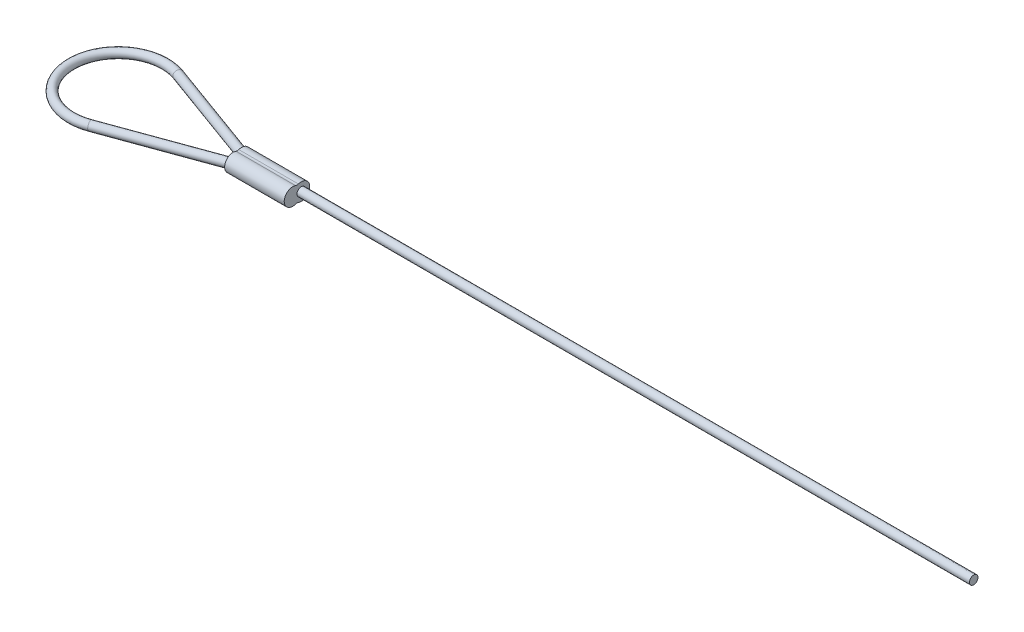
ISO-10303-21;
HEADER;
FILE_DESCRIPTION(('STEP AP214'),'2;1');
FILE_NAME('part.step','',(''),(''),'','','');
FILE_SCHEMA(('AUTOMOTIVE_DESIGN { 1 0 10303 214 1 1 1 1 }'));
ENDSEC;
DATA;
#1=APPLICATION_CONTEXT('core data for automotive mechanical design processes');
#2=APPLICATION_PROTOCOL_DEFINITION('international standard','automotive_design',2000,#1);
#3=PRODUCT_CONTEXT('',#1,'mechanical');
#4=PRODUCT('Part','Part','',(#3));
#5=PRODUCT_RELATED_PRODUCT_CATEGORY('part','',(#4));
#6=PRODUCT_DEFINITION_FORMATION('','',#4);
#7=PRODUCT_DEFINITION_CONTEXT('part definition',#1,'design');
#8=PRODUCT_DEFINITION('design','',#6,#7);
#9=PRODUCT_DEFINITION_SHAPE('','',#8);
#10=(LENGTH_UNIT() NAMED_UNIT(*) SI_UNIT(.MILLI.,.METRE.));
#11=(NAMED_UNIT(*) PLANE_ANGLE_UNIT() SI_UNIT($,.RADIAN.));
#12=(NAMED_UNIT(*) SI_UNIT($,.STERADIAN.) SOLID_ANGLE_UNIT());
#13=UNCERTAINTY_MEASURE_WITH_UNIT(LENGTH_MEASURE(1.E-05),#10,'distance_accuracy_value','');
#14=(GEOMETRIC_REPRESENTATION_CONTEXT(3) GLOBAL_UNCERTAINTY_ASSIGNED_CONTEXT((#13)) GLOBAL_UNIT_ASSIGNED_CONTEXT((#10,
#11,#12)) REPRESENTATION_CONTEXT('',''));
#15=CARTESIAN_POINT('',(0.,0.,0.));
#16=DIRECTION('',(0.,0.,1.));
#17=DIRECTION('',(1.,0.,0.));
#18=AXIS2_PLACEMENT_3D('',#15,#16,#17);
#19=CARTESIAN_POINT('',(0.,0.,0.));
#20=DIRECTION('',(0.,-1.,0.));
#21=DIRECTION('',(0.,0.,-1.));
#22=AXIS2_PLACEMENT_3D('',#19,#20,#21);
#23=TOROIDAL_SURFACE('',#22,5.5,0.5);
#24=CARTESIAN_POINT('',(1.88111078829118,0.,5.1683094143225));
#25=DIRECTION('',(-0.939692620785908,0.,0.342020143325669));
#26=DIRECTION('',(0.342020143325669,0.,0.939692620785908));
#27=AXIS2_PLACEMENT_3D('',#24,#25,#26);
#28=CIRCLE('',#27,0.5);
#29=CARTESIAN_POINT('',(2.05212085995401,0.,5.63815572471545));
#30=VERTEX_POINT('',#29);
#31=EDGE_CURVE('E67',#30,#30,#28,.F.);
#32=CARTESIAN_POINT('',(1.88111078829118,0.,-5.1683094143225));
#33=DIRECTION('',(-0.939692620785908,0.,-0.342020143325669));
#34=DIRECTION('',(-0.342020143325669,0.,0.939692620785908));
#35=AXIS2_PLACEMENT_3D('',#32,#33,#34);
#36=CIRCLE('',#35,0.5);
#37=CARTESIAN_POINT('',(2.05212085995401,0.,-5.63815572471544));
#38=VERTEX_POINT('',#37);
#39=EDGE_CURVE('E220',#38,#38,#36,.F.);
#40=CARTESIAN_POINT('',(0.,0.,0.));
#41=DIRECTION('',(0.,-1.,0.));
#42=DIRECTION('',(0.,0.,-1.));
#43=AXIS2_PLACEMENT_3D('',#40,#41,#42);
#44=CIRCLE('',#43,5.99999999999999);
#45=EDGE_CURVE('',#30,#38,#44,.T.);
#46=ORIENTED_EDGE('',*,*,#31,.F.);
#47=ORIENTED_EDGE('',*,*,#39,.F.);
#48=ORIENTED_EDGE('',*,*,#45,.T.);
#49=ORIENTED_EDGE('',*,*,#45,.F.);
#50=EDGE_LOOP('',(#46,#48,#47,#49));
#51=FACE_BOUND('',#50,.T.);
#52=ADVANCED_FACE('F18',(#51),#23,.T.);
#53=CARTESIAN_POINT('',(1.88111078829118,0.,-5.1683094143225));
#54=DIRECTION('',(-0.939692620785908,0.,-0.342020143325669));
#55=DIRECTION('',(-0.342020143325669,0.,0.939692620785908));
#56=AXIS2_PLACEMENT_3D('',#53,#54,#55);
#57=CYLINDRICAL_SURFACE('',#56,0.5);
#58=ORIENTED_EDGE('',*,*,#39,.T.);
#59=EDGE_LOOP('',(#58));
#60=FACE_BOUND('',#59,.T.);
#61=CARTESIAN_POINT('',(14.,0.,-0.757394468890685));
#62=DIRECTION('',(1.,0.,0.));
#63=DIRECTION('',(0.,0.,-1.));
#64=AXIS2_PLACEMENT_3D('',#61,#62,#63);
#65=ELLIPSE('',#64,0.532088886237956,0.5);
#66=CARTESIAN_POINT('',(14.,0.,-1.28948335512864));
#67=VERTEX_POINT('',#66);
#68=EDGE_CURVE('E66',#67,#67,#65,.F.);
#69=ORIENTED_EDGE('',*,*,#68,.T.);
#70=EDGE_LOOP('',(#69));
#71=FACE_BOUND('',#70,.T.);
#72=ADVANCED_FACE('F100',(#60,#71),#57,.T.);
#73=CARTESIAN_POINT('',(1.88111078829118,0.,5.1683094143225));
#74=DIRECTION('',(-0.939692620785908,0.,0.342020143325669));
#75=DIRECTION('',(0.342020143325669,0.,0.939692620785908));
#76=AXIS2_PLACEMENT_3D('',#73,#74,#75);
#77=CYLINDRICAL_SURFACE('',#76,0.5);
#78=ORIENTED_EDGE('',*,*,#31,.T.);
#79=EDGE_LOOP('',(#78));
#80=FACE_BOUND('',#79,.T.);
#81=CARTESIAN_POINT('',(14.,0.,0.757394468890685));
#82=DIRECTION('',(1.,0.,0.));
#83=DIRECTION('',(0.,0.,1.));
#84=AXIS2_PLACEMENT_3D('',#81,#82,#83);
#85=ELLIPSE('',#84,0.532088886237956,0.5);
#86=CARTESIAN_POINT('',(14.,0.,1.28948335512864));
#87=VERTEX_POINT('',#86);
#88=EDGE_CURVE('E95',#87,#87,#85,.F.);
#89=ORIENTED_EDGE('',*,*,#88,.T.);
#90=EDGE_LOOP('',(#89));
#91=FACE_BOUND('',#90,.T.);
#92=ADVANCED_FACE('F113',(#80,#91),#77,.T.);
#93=CARTESIAN_POINT('',(14.,1.4142135623731,0.));
#94=DIRECTION('',(-1.,0.,0.));
#95=DIRECTION('',(0.,0.,1.));
#96=AXIS2_PLACEMENT_3D('',#93,#94,#95);
#97=CYLINDRICAL_SURFACE('',#96,0.500000000000001);
#98=CARTESIAN_POINT('',(14.,1.4142135623731,0.));
#99=DIRECTION('',(-1.,0.,0.));
#100=DIRECTION('',(0.,0.,1.));
#101=AXIS2_PLACEMENT_3D('',#98,#99,#100);
#102=CIRCLE('',#101,0.500000000000001);
#103=CARTESIAN_POINT('',(14.,0.942809041582065,-0.166666666666666));
#104=VERTEX_POINT('',#103);
#105=CARTESIAN_POINT('',(14.,0.942809041582065,0.166666666666667));
#106=VERTEX_POINT('',#105);
#107=EDGE_CURVE('E93',#104,#106,#102,.T.);
#108=ORIENTED_EDGE('',*,*,#107,.T.);
#109=DIRECTION('',(-1.,0.,0.));
#110=VECTOR('',#109,1.);
#111=CARTESIAN_POINT('',(14.,0.942809041582064,0.166666666666667));
#112=LINE('',#111,#110);
#113=CARTESIAN_POINT('',(21.,0.942809041582065,0.166666666666667));
#114=VERTEX_POINT('',#113);
#115=EDGE_CURVE('E62',#114,#106,#112,.T.);
#116=ORIENTED_EDGE('',*,*,#115,.F.);
#117=CARTESIAN_POINT('',(21.,1.4142135623731,0.));
#118=DIRECTION('',(-1.,0.,0.));
#119=DIRECTION('',(0.,0.,1.));
#120=AXIS2_PLACEMENT_3D('',#117,#118,#119);
#121=CIRCLE('',#120,0.500000000000001);
#122=CARTESIAN_POINT('',(21.,0.942809041582065,-0.166666666666666));
#123=VERTEX_POINT('',#122);
#124=EDGE_CURVE('E21',#123,#114,#121,.T.);
#125=ORIENTED_EDGE('',*,*,#124,.F.);
#126=DIRECTION('',(-1.,0.,0.));
#127=VECTOR('',#126,1.);
#128=CARTESIAN_POINT('',(14.,0.942809041582063,-0.166666666666667));
#129=LINE('',#128,#127);
#130=EDGE_CURVE('E59',#104,#123,#129,.F.);
#131=ORIENTED_EDGE('',*,*,#130,.F.);
#132=EDGE_LOOP('',(#108,#116,#125,#131));
#133=FACE_BOUND('',#132,.T.);
#134=ADVANCED_FACE('F58',(#133),#97,.F.);
#135=CARTESIAN_POINT('',(14.,0.,0.));
#136=DIRECTION('',(1.,0.,0.));
#137=DIRECTION('',(0.,0.,-1.));
#138=AXIS2_PLACEMENT_3D('',#135,#136,#137);
#139=PLANE('',#138);
#140=CARTESIAN_POINT('',(14.,0.,-0.5));
#141=DIRECTION('',(-1.,0.,0.));
#142=DIRECTION('',(0.,0.,1.));
#143=AXIS2_PLACEMENT_3D('',#140,#141,#142);
#144=CIRCLE('',#143,1.);
#145=CARTESIAN_POINT('',(14.,-0.942809041582065,-0.166666666666667));
#146=VERTEX_POINT('',#145);
#147=EDGE_CURVE('E74',#146,#104,#144,.F.);
#148=ORIENTED_EDGE('',*,*,#147,.F.);
#149=CARTESIAN_POINT('',(14.,-1.4142135623731,0.));
#150=DIRECTION('',(-1.,0.,0.));
#151=DIRECTION('',(0.,0.,1.));
#152=AXIS2_PLACEMENT_3D('',#149,#150,#151);
#153=CIRCLE('',#152,0.500000000000001);
#154=CARTESIAN_POINT('',(14.,-0.942809041582065,0.166666666666667));
#155=VERTEX_POINT('',#154);
#156=EDGE_CURVE('E89',#146,#155,#153,.F.);
#157=ORIENTED_EDGE('',*,*,#156,.T.);
#158=CARTESIAN_POINT('',(14.,0.,0.5));
#159=DIRECTION('',(-1.,0.,0.));
#160=DIRECTION('',(0.,0.,1.));
#161=AXIS2_PLACEMENT_3D('',#158,#159,#160);
#162=CIRCLE('',#161,1.);
#163=EDGE_CURVE('E81',#106,#155,#162,.F.);
#164=ORIENTED_EDGE('',*,*,#163,.F.);
#165=ORIENTED_EDGE('',*,*,#107,.F.);
#166=EDGE_LOOP('',(#148,#157,#164,#165));
#167=FACE_BOUND('',#166,.T.);
#168=ORIENTED_EDGE('',*,*,#88,.F.);
#169=EDGE_LOOP('',(#168));
#170=FACE_BOUND('',#169,.T.);
#171=ORIENTED_EDGE('',*,*,#68,.F.);
#172=EDGE_LOOP('',(#171));
#173=FACE_BOUND('',#172,.T.);
#174=ADVANCED_FACE('F102',(#167,#170,#173),#139,.F.);
#175=CARTESIAN_POINT('',(14.,-1.4142135623731,0.));
#176=DIRECTION('',(-1.,0.,0.));
#177=DIRECTION('',(0.,0.,1.));
#178=AXIS2_PLACEMENT_3D('',#175,#176,#177);
#179=CYLINDRICAL_SURFACE('',#178,0.500000000000001);
#180=ORIENTED_EDGE('',*,*,#156,.F.);
#181=DIRECTION('',(-1.,0.,0.));
#182=VECTOR('',#181,1.);
#183=CARTESIAN_POINT('',(14.,-0.942809041582064,-0.166666666666668));
#184=LINE('',#183,#182);
#185=CARTESIAN_POINT('',(21.,-0.942809041582065,-0.166666666666667));
#186=VERTEX_POINT('',#185);
#187=EDGE_CURVE('E88',#186,#146,#184,.T.);
#188=ORIENTED_EDGE('',*,*,#187,.F.);
#189=CARTESIAN_POINT('',(21.,-1.4142135623731,0.));
#190=DIRECTION('',(-1.,0.,0.));
#191=DIRECTION('',(0.,0.,1.));
#192=AXIS2_PLACEMENT_3D('',#189,#190,#191);
#193=CIRCLE('',#192,0.500000000000001);
#194=CARTESIAN_POINT('',(21.,-0.942809041582065,0.166666666666667));
#195=VERTEX_POINT('',#194);
#196=EDGE_CURVE('E35',#195,#186,#193,.T.);
#197=ORIENTED_EDGE('',*,*,#196,.F.);
#198=DIRECTION('',(-1.,0.,0.));
#199=VECTOR('',#198,1.);
#200=CARTESIAN_POINT('',(14.,-0.942809041582064,0.166666666666667));
#201=LINE('',#200,#199);
#202=EDGE_CURVE('E78',#155,#195,#201,.F.);
#203=ORIENTED_EDGE('',*,*,#202,.F.);
#204=EDGE_LOOP('',(#180,#188,#197,#203));
#205=FACE_BOUND('',#204,.T.);
#206=ADVANCED_FACE('F104',(#205),#179,.F.);
#207=CARTESIAN_POINT('',(14.,0.,-0.5));
#208=DIRECTION('',(-1.,0.,0.));
#209=DIRECTION('',(0.,0.,1.));
#210=AXIS2_PLACEMENT_3D('',#207,#208,#209);
#211=CYLINDRICAL_SURFACE('',#210,1.);
#212=ORIENTED_EDGE('',*,*,#130,.T.);
#213=CARTESIAN_POINT('',(21.,0.,-0.5));
#214=DIRECTION('',(-1.,0.,0.));
#215=DIRECTION('',(0.,0.,1.));
#216=AXIS2_PLACEMENT_3D('',#213,#214,#215);
#217=CIRCLE('',#216,1.);
#218=EDGE_CURVE('E72',#186,#123,#217,.F.);
#219=ORIENTED_EDGE('',*,*,#218,.F.);
#220=ORIENTED_EDGE('',*,*,#187,.T.);
#221=ORIENTED_EDGE('',*,*,#147,.T.);
#222=EDGE_LOOP('',(#212,#219,#220,#221));
#223=FACE_BOUND('',#222,.T.);
#224=ADVANCED_FACE('F70',(#223),#211,.T.);
#225=CARTESIAN_POINT('',(14.,0.,0.5));
#226=DIRECTION('',(-1.,0.,0.));
#227=DIRECTION('',(0.,0.,1.));
#228=AXIS2_PLACEMENT_3D('',#225,#226,#227);
#229=CYLINDRICAL_SURFACE('',#228,1.);
#230=ORIENTED_EDGE('',*,*,#163,.T.);
#231=ORIENTED_EDGE('',*,*,#202,.T.);
#232=CARTESIAN_POINT('',(21.,0.,0.5));
#233=DIRECTION('',(-1.,0.,0.));
#234=DIRECTION('',(0.,0.,1.));
#235=AXIS2_PLACEMENT_3D('',#232,#233,#234);
#236=CIRCLE('',#235,1.);
#237=EDGE_CURVE('E77',#114,#195,#236,.F.);
#238=ORIENTED_EDGE('',*,*,#237,.F.);
#239=ORIENTED_EDGE('',*,*,#115,.T.);
#240=EDGE_LOOP('',(#230,#231,#238,#239));
#241=FACE_BOUND('',#240,.T.);
#242=ADVANCED_FACE('F130',(#241),#229,.T.);
#243=CARTESIAN_POINT('',(100.,-1.,5.99999999999999));
#244=DIRECTION('',(-1.,0.,0.));
#245=DIRECTION('',(0.,0.,1.));
#246=AXIS2_PLACEMENT_3D('',#243,#244,#245);
#247=PLANE('',#246);
#248=CARTESIAN_POINT('',(100.,0.,-0.5));
#249=DIRECTION('',(-1.,0.,0.));
#250=DIRECTION('',(0.,0.,1.));
#251=AXIS2_PLACEMENT_3D('',#248,#249,#250);
#252=CIRCLE('',#251,0.5);
#253=CARTESIAN_POINT('',(100.,0.,0.));
#254=VERTEX_POINT('',#253);
#255=EDGE_CURVE('E27',#254,#254,#252,.T.);
#256=ORIENTED_EDGE('',*,*,#255,.F.);
#257=EDGE_LOOP('',(#256));
#258=FACE_BOUND('',#257,.T.);
#259=ADVANCED_FACE('F123',(#258),#247,.F.);
#260=CARTESIAN_POINT('',(21.,0.,0.));
#261=DIRECTION('',(1.,0.,0.));
#262=DIRECTION('',(0.,0.,-1.));
#263=AXIS2_PLACEMENT_3D('',#260,#261,#262);
#264=PLANE('',#263);
#265=CARTESIAN_POINT('',(21.,0.,-0.5));
#266=DIRECTION('',(-1.,0.,0.));
#267=DIRECTION('',(0.,0.,1.));
#268=AXIS2_PLACEMENT_3D('',#265,#266,#267);
#269=CIRCLE('',#268,0.5);
#270=CARTESIAN_POINT('',(21.,0.,0.));
#271=VERTEX_POINT('',#270);
#272=EDGE_CURVE('E11',#271,#271,#269,.F.);
#273=ORIENTED_EDGE('',*,*,#272,.F.);
#274=EDGE_LOOP('',(#273));
#275=FACE_BOUND('',#274,.T.);
#276=ORIENTED_EDGE('',*,*,#237,.T.);
#277=ORIENTED_EDGE('',*,*,#196,.T.);
#278=ORIENTED_EDGE('',*,*,#218,.T.);
#279=ORIENTED_EDGE('',*,*,#124,.T.);
#280=EDGE_LOOP('',(#276,#277,#278,#279));
#281=FACE_BOUND('',#280,.T.);
#282=ADVANCED_FACE('F76',(#275,#281),#264,.T.);
#283=CARTESIAN_POINT('',(21.,0.,-0.5));
#284=DIRECTION('',(-1.,0.,0.));
#285=DIRECTION('',(0.,0.,1.));
#286=AXIS2_PLACEMENT_3D('',#283,#284,#285);
#287=CYLINDRICAL_SURFACE('',#286,0.5);
#288=ORIENTED_EDGE('',*,*,#272,.T.);
#289=EDGE_LOOP('',(#288));
#290=FACE_BOUND('',#289,.T.);
#291=ORIENTED_EDGE('',*,*,#255,.T.);
#292=EDGE_LOOP('',(#291));
#293=FACE_BOUND('',#292,.T.);
#294=ADVANCED_FACE('F116',(#290,#293),#287,.T.);
#295=CLOSED_SHELL('',(#52,#72,#92,#134,#174,#206,#224,#242,#259,#282,#294));
#296=MANIFOLD_SOLID_BREP('B1',#295);
#297=ADVANCED_BREP_SHAPE_REPRESENTATION('',(#18,#296),#14);
#298=SHAPE_DEFINITION_REPRESENTATION(#9,#297);
ENDSEC;
END-ISO-10303-21;
